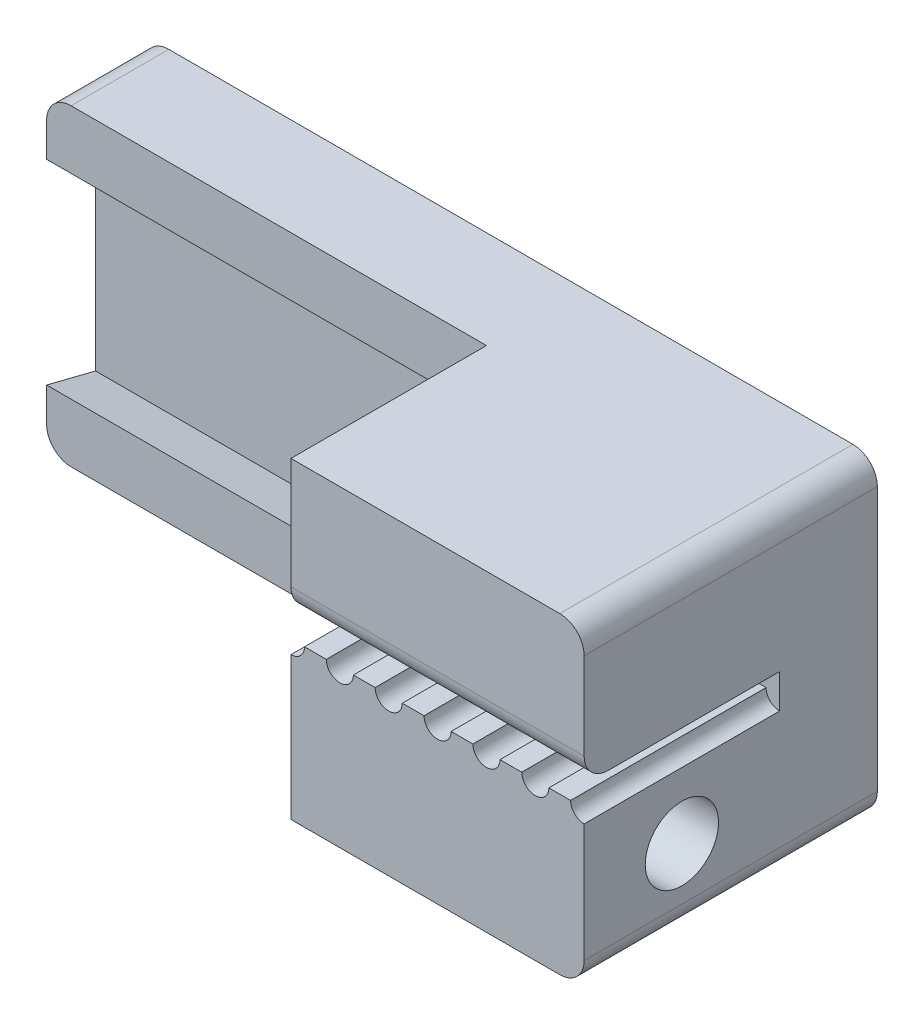
ISO-10303-21;
HEADER;
FILE_DESCRIPTION(('STEP AP214'),'2;1');
FILE_NAME('part.step','',(''),(''),'','','');
FILE_SCHEMA(('AUTOMOTIVE_DESIGN { 1 0 10303 214 1 1 1 1 }'));
ENDSEC;
DATA;
#1=APPLICATION_CONTEXT('core data for automotive mechanical design processes');
#2=APPLICATION_PROTOCOL_DEFINITION('international standard','automotive_design',2000,#1);
#3=PRODUCT_CONTEXT('',#1,'mechanical');
#4=PRODUCT('Part','Part','',(#3));
#5=PRODUCT_RELATED_PRODUCT_CATEGORY('part','',(#4));
#6=PRODUCT_DEFINITION_FORMATION('','',#4);
#7=PRODUCT_DEFINITION_CONTEXT('part definition',#1,'design');
#8=PRODUCT_DEFINITION('design','',#6,#7);
#9=PRODUCT_DEFINITION_SHAPE('','',#8);
#10=(LENGTH_UNIT() NAMED_UNIT(*) SI_UNIT(.MILLI.,.METRE.));
#11=(NAMED_UNIT(*) PLANE_ANGLE_UNIT() SI_UNIT($,.RADIAN.));
#12=(NAMED_UNIT(*) SI_UNIT($,.STERADIAN.) SOLID_ANGLE_UNIT());
#13=UNCERTAINTY_MEASURE_WITH_UNIT(LENGTH_MEASURE(1.E-05),#10,'distance_accuracy_value','');
#14=(GEOMETRIC_REPRESENTATION_CONTEXT(3) GLOBAL_UNCERTAINTY_ASSIGNED_CONTEXT((#13)) GLOBAL_UNIT_ASSIGNED_CONTEXT((#10,
#11,#12)) REPRESENTATION_CONTEXT('',''));
#15=CARTESIAN_POINT('',(0.,0.,0.));
#16=DIRECTION('',(0.,0.,1.));
#17=DIRECTION('',(1.,0.,0.));
#18=AXIS2_PLACEMENT_3D('',#15,#16,#17);
#19=CARTESIAN_POINT('',(-17.,1.1,12.));
#20=DIRECTION('',(0.,0.,-1.));
#21=DIRECTION('',(-1.,0.,0.));
#22=AXIS2_PLACEMENT_3D('',#19,#20,#21);
#23=PLANE('',#22);
#24=DIRECTION('',(0.,-1.,0.));
#25=VECTOR('',#24,1.);
#26=CARTESIAN_POINT('',(0.,12.9,12.));
#27=LINE('',#26,#25);
#28=CARTESIAN_POINT('',(0.,5.945,12.));
#29=VERTEX_POINT('',#28);
#30=CARTESIAN_POINT('',(0.,0.1,12.));
#31=VERTEX_POINT('',#30);
#32=EDGE_CURVE('E570',#29,#31,#27,.T.);
#33=ORIENTED_EDGE('',*,*,#32,.T.);
#34=DIRECTION('',(1.,0.,0.));
#35=VECTOR('',#34,1.);
#36=CARTESIAN_POINT('',(11.,0.1,12.));
#37=LINE('',#36,#35);
#38=CARTESIAN_POINT('',(11.,0.1,12.));
#39=VERTEX_POINT('',#38);
#40=EDGE_CURVE('E476',#31,#39,#37,.T.);
#41=ORIENTED_EDGE('',*,*,#40,.T.);
#42=CARTESIAN_POINT('',(11.,1.1,12.));
#43=DIRECTION('',(0.,0.,1.));
#44=DIRECTION('',(1.,0.,0.));
#45=AXIS2_PLACEMENT_3D('',#42,#43,#44);
#46=CIRCLE('',#45,0.999999999999999);
#47=CARTESIAN_POINT('',(12.,1.1,12.));
#48=VERTEX_POINT('',#47);
#49=EDGE_CURVE('E479',#39,#48,#46,.T.);
#50=ORIENTED_EDGE('',*,*,#49,.T.);
#51=DIRECTION('',(0.,1.,0.));
#52=VECTOR('',#51,1.);
#53=CARTESIAN_POINT('',(12.,1.10000000000001,12.));
#54=LINE('',#53,#52);
#55=CARTESIAN_POINT('',(12.,5.94500000000013,12.));
#56=VERTEX_POINT('',#55);
#57=EDGE_CURVE('E484',#48,#56,#54,.T.);
#58=ORIENTED_EDGE('',*,*,#57,.T.);
#59=CARTESIAN_POINT('',(12.,6.50000000000013,12.));
#60=DIRECTION('',(0.,0.,1.));
#61=DIRECTION('',(1.,0.,0.));
#62=AXIS2_PLACEMENT_3D('',#59,#60,#61);
#63=CIRCLE('',#62,0.555);
#64=CARTESIAN_POINT('',(11.445,6.50000000000012,12.));
#65=VERTEX_POINT('',#64);
#66=EDGE_CURVE('E383',#65,#56,#63,.T.);
#67=ORIENTED_EDGE('',*,*,#66,.F.);
#68=DIRECTION('',(1.,0.,0.));
#69=VECTOR('',#68,1.);
#70=CARTESIAN_POINT('',(11.445,6.50000000000012,12.));
#71=LINE('',#70,#69);
#72=CARTESIAN_POINT('',(10.555,6.50000000000012,12.));
#73=VERTEX_POINT('',#72);
#74=EDGE_CURVE('E379',#73,#65,#71,.T.);
#75=ORIENTED_EDGE('',*,*,#74,.F.);
#76=CARTESIAN_POINT('',(9.99999999999999,6.50000000000011,12.));
#77=DIRECTION('',(0.,0.,1.));
#78=DIRECTION('',(1.,0.,0.));
#79=AXIS2_PLACEMENT_3D('',#76,#77,#78);
#80=CIRCLE('',#79,0.555);
#81=CARTESIAN_POINT('',(9.44499999999999,6.5000000000001,12.));
#82=VERTEX_POINT('',#81);
#83=EDGE_CURVE('E310',#82,#73,#80,.T.);
#84=ORIENTED_EDGE('',*,*,#83,.F.);
#85=DIRECTION('',(1.,0.,0.));
#86=VECTOR('',#85,1.);
#87=CARTESIAN_POINT('',(9.44499999999999,6.5000000000001,12.));
#88=LINE('',#87,#86);
#89=CARTESIAN_POINT('',(8.555,6.50000000000009,12.));
#90=VERTEX_POINT('',#89);
#91=EDGE_CURVE('E316',#90,#82,#88,.T.);
#92=ORIENTED_EDGE('',*,*,#91,.F.);
#93=CARTESIAN_POINT('',(8.,6.50000000000009,12.));
#94=DIRECTION('',(0.,0.,1.));
#95=DIRECTION('',(1.,0.,0.));
#96=AXIS2_PLACEMENT_3D('',#93,#94,#95);
#97=CIRCLE('',#96,0.555);
#98=CARTESIAN_POINT('',(7.445,6.50000000000008,12.));
#99=VERTEX_POINT('',#98);
#100=EDGE_CURVE('E418',#99,#90,#97,.T.);
#101=ORIENTED_EDGE('',*,*,#100,.F.);
#102=DIRECTION('',(1.,0.,0.));
#103=VECTOR('',#102,1.);
#104=CARTESIAN_POINT('',(7.445,6.50000000000008,12.));
#105=LINE('',#104,#103);
#106=CARTESIAN_POINT('',(6.555,6.50000000000008,12.));
#107=VERTEX_POINT('',#106);
#108=EDGE_CURVE('E414',#107,#99,#105,.T.);
#109=ORIENTED_EDGE('',*,*,#108,.F.);
#110=CARTESIAN_POINT('',(6.,6.50000000000006,12.));
#111=DIRECTION('',(0.,0.,1.));
#112=DIRECTION('',(-1.,0.,0.));
#113=AXIS2_PLACEMENT_3D('',#110,#111,#112);
#114=CIRCLE('',#113,0.555);
#115=CARTESIAN_POINT('',(5.445,6.50000000000006,12.));
#116=VERTEX_POINT('',#115);
#117=EDGE_CURVE('E410',#116,#107,#114,.T.);
#118=ORIENTED_EDGE('',*,*,#117,.F.);
#119=DIRECTION('',(1.,0.,0.));
#120=VECTOR('',#119,1.);
#121=CARTESIAN_POINT('',(5.445,6.50000000000006,12.));
#122=LINE('',#121,#120);
#123=CARTESIAN_POINT('',(4.555,6.50000000000006,12.));
#124=VERTEX_POINT('',#123);
#125=EDGE_CURVE('E406',#124,#116,#122,.T.);
#126=ORIENTED_EDGE('',*,*,#125,.F.);
#127=CARTESIAN_POINT('',(4.,6.50000000000004,12.));
#128=DIRECTION('',(0.,0.,1.));
#129=DIRECTION('',(-1.,0.,0.));
#130=AXIS2_PLACEMENT_3D('',#127,#128,#129);
#131=CIRCLE('',#130,0.555000000000003);
#132=CARTESIAN_POINT('',(3.445,6.50000000000004,12.));
#133=VERTEX_POINT('',#132);
#134=EDGE_CURVE('E402',#133,#124,#131,.T.);
#135=ORIENTED_EDGE('',*,*,#134,.F.);
#136=DIRECTION('',(1.,0.,0.));
#137=VECTOR('',#136,1.);
#138=CARTESIAN_POINT('',(3.445,6.50000000000004,12.));
#139=LINE('',#138,#137);
#140=CARTESIAN_POINT('',(2.555,6.50000000000002,12.));
#141=VERTEX_POINT('',#140);
#142=EDGE_CURVE('E398',#141,#133,#139,.T.);
#143=ORIENTED_EDGE('',*,*,#142,.F.);
#144=CARTESIAN_POINT('',(2.,6.50000000000002,12.));
#145=DIRECTION('',(0.,0.,1.));
#146=DIRECTION('',(1.,0.,0.));
#147=AXIS2_PLACEMENT_3D('',#144,#145,#146);
#148=CIRCLE('',#147,0.555);
#149=CARTESIAN_POINT('',(1.445,6.50000000000002,12.));
#150=VERTEX_POINT('',#149);
#151=EDGE_CURVE('E394',#150,#141,#148,.T.);
#152=ORIENTED_EDGE('',*,*,#151,.F.);
#153=DIRECTION('',(1.,0.,0.));
#154=VECTOR('',#153,1.);
#155=CARTESIAN_POINT('',(1.445,6.50000000000002,12.));
#156=LINE('',#155,#154);
#157=CARTESIAN_POINT('',(0.555000000000007,6.50000000000002,12.));
#158=VERTEX_POINT('',#157);
#159=EDGE_CURVE('E390',#158,#150,#156,.T.);
#160=ORIENTED_EDGE('',*,*,#159,.F.);
#161=CARTESIAN_POINT('',(0.,6.5,12.));
#162=DIRECTION('',(0.,0.,1.));
#163=DIRECTION('',(-1.,0.,0.));
#164=AXIS2_PLACEMENT_3D('',#161,#162,#163);
#165=CIRCLE('',#164,0.555000000000007);
#166=EDGE_CURVE('E386',#29,#158,#165,.T.);
#167=ORIENTED_EDGE('',*,*,#166,.F.);
#168=EDGE_LOOP('',(#33,#41,#50,#58,#67,#75,#84,#92,#101,#109,#118,#126,#135,#143,#152,#160,#167));
#169=FACE_BOUND('',#168,.T.);
#170=ADVANCED_FACE('F39',(#169),#23,.F.);
#171=CARTESIAN_POINT('',(0.,12.9,12.));
#172=VERTEX_POINT('',#171);
#173=CARTESIAN_POINT('',(0.,8.34499999999995,12.));
#174=VERTEX_POINT('',#173);
#175=EDGE_CURVE('E567',#172,#174,#27,.T.);
#176=ORIENTED_EDGE('',*,*,#175,.T.);
#177=DIRECTION('',(-1.,0.,0.));
#178=VECTOR('',#177,1.);
#179=CARTESIAN_POINT('',(-17.,8.34499999999995,12.));
#180=LINE('',#179,#178);
#181=CARTESIAN_POINT('',(12.,8.34499999999995,12.));
#182=VERTEX_POINT('',#181);
#183=EDGE_CURVE('E55',#174,#182,#180,.F.);
#184=ORIENTED_EDGE('',*,*,#183,.T.);
#185=CARTESIAN_POINT('',(12.,11.9,12.));
#186=VERTEX_POINT('',#185);
#187=EDGE_CURVE('E483',#182,#186,#54,.T.);
#188=ORIENTED_EDGE('',*,*,#187,.T.);
#189=CARTESIAN_POINT('',(11.,11.9,12.));
#190=DIRECTION('',(0.,0.,1.));
#191=DIRECTION('',(-1.,0.,0.));
#192=AXIS2_PLACEMENT_3D('',#189,#190,#191);
#193=CIRCLE('',#192,1.);
#194=CARTESIAN_POINT('',(11.,12.9,12.));
#195=VERTEX_POINT('',#194);
#196=EDGE_CURVE('E488',#186,#195,#193,.T.);
#197=ORIENTED_EDGE('',*,*,#196,.T.);
#198=DIRECTION('',(-1.,0.,0.));
#199=VECTOR('',#198,1.);
#200=CARTESIAN_POINT('',(11.,12.9,12.));
#201=LINE('',#200,#199);
#202=EDGE_CURVE('E491',#195,#172,#201,.T.);
#203=ORIENTED_EDGE('',*,*,#202,.T.);
#204=EDGE_LOOP('',(#176,#184,#188,#197,#203));
#205=FACE_BOUND('',#204,.T.);
#206=ADVANCED_FACE('F628',(#205),#23,.F.);
#207=CARTESIAN_POINT('',(-17.,1.1,12.));
#208=DIRECTION('',(0.,0.,-1.));
#209=DIRECTION('',(-1.,0.,0.));
#210=AXIS2_PLACEMENT_3D('',#207,#208,#209);
#211=CYLINDRICAL_SURFACE('',#210,1.);
#212=DIRECTION('',(0.,0.,-1.));
#213=VECTOR('',#212,1.);
#214=CARTESIAN_POINT('',(-17.,0.1,12.));
#215=LINE('',#214,#213);
#216=CARTESIAN_POINT('',(-17.,0.1,3.99999999999981));
#217=VERTEX_POINT('',#216);
#218=CARTESIAN_POINT('',(-17.,0.1,0.));
#219=VERTEX_POINT('',#218);
#220=EDGE_CURVE('E546',#217,#219,#215,.T.);
#221=ORIENTED_EDGE('',*,*,#220,.F.);
#222=CARTESIAN_POINT('',(-17.,1.1,3.99999999999981));
#223=DIRECTION('',(0.,0.,-1.));
#224=DIRECTION('',(-1.,0.,0.));
#225=AXIS2_PLACEMENT_3D('',#222,#223,#224);
#226=CIRCLE('',#225,1.);
#227=CARTESIAN_POINT('',(-18.,1.10000000000001,3.99999999999981));
#228=VERTEX_POINT('',#227);
#229=EDGE_CURVE('E301',#217,#228,#226,.T.);
#230=ORIENTED_EDGE('',*,*,#229,.T.);
#231=DIRECTION('',(0.,0.,-1.));
#232=VECTOR('',#231,1.);
#233=CARTESIAN_POINT('',(-18.,1.10000000000001,12.));
#234=LINE('',#233,#232);
#235=CARTESIAN_POINT('',(-18.,1.10000000000001,0.));
#236=VERTEX_POINT('',#235);
#237=EDGE_CURVE('E495',#228,#236,#234,.T.);
#238=ORIENTED_EDGE('',*,*,#237,.T.);
#239=CARTESIAN_POINT('',(-17.,1.1,0.));
#240=DIRECTION('',(0.,0.,1.));
#241=DIRECTION('',(-1.,0.,0.));
#242=AXIS2_PLACEMENT_3D('',#239,#240,#241);
#243=CIRCLE('',#242,1.);
#244=EDGE_CURVE('E428',#236,#219,#243,.T.);
#245=ORIENTED_EDGE('',*,*,#244,.T.);
#246=EDGE_LOOP('',(#221,#230,#238,#245));
#247=FACE_BOUND('',#246,.T.);
#248=ADVANCED_FACE('F634',(#247),#211,.T.);
#249=CARTESIAN_POINT('',(11.,0.1,12.));
#250=DIRECTION('',(0.,1.,0.));
#251=DIRECTION('',(0.,0.,1.));
#252=AXIS2_PLACEMENT_3D('',#249,#250,#251);
#253=PLANE('',#252);
#254=DIRECTION('',(0.,0.,-1.));
#255=VECTOR('',#254,1.);
#256=CARTESIAN_POINT('',(0.,0.1,12.));
#257=LINE('',#256,#255);
#258=CARTESIAN_POINT('',(0.,0.1,3.99999999999981));
#259=VERTEX_POINT('',#258);
#260=EDGE_CURVE('E574',#31,#259,#257,.T.);
#261=ORIENTED_EDGE('',*,*,#260,.T.);
#262=DIRECTION('',(-1.,0.,0.));
#263=VECTOR('',#262,1.);
#264=CARTESIAN_POINT('',(16.2431524033976,0.1,3.99999999999981));
#265=LINE('',#264,#263);
#266=EDGE_CURVE('E293',#259,#217,#265,.T.);
#267=ORIENTED_EDGE('',*,*,#266,.T.);
#268=ORIENTED_EDGE('',*,*,#220,.T.);
#269=DIRECTION('',(1.,0.,0.));
#270=VECTOR('',#269,1.);
#271=CARTESIAN_POINT('',(11.,0.1,0.));
#272=LINE('',#271,#270);
#273=CARTESIAN_POINT('',(11.,0.1,0.));
#274=VERTEX_POINT('',#273);
#275=EDGE_CURVE('E499',#219,#274,#272,.T.);
#276=ORIENTED_EDGE('',*,*,#275,.T.);
#277=DIRECTION('',(0.,0.,-1.));
#278=VECTOR('',#277,1.);
#279=CARTESIAN_POINT('',(11.,0.1,12.));
#280=LINE('',#279,#278);
#281=EDGE_CURVE('E542',#39,#274,#280,.T.);
#282=ORIENTED_EDGE('',*,*,#281,.F.);
#283=ORIENTED_EDGE('',*,*,#40,.F.);
#284=EDGE_LOOP('',(#261,#267,#268,#276,#282,#283));
#285=FACE_BOUND('',#284,.T.);
#286=ADVANCED_FACE('F662',(#285),#253,.F.);
#287=CARTESIAN_POINT('',(11.,1.1,12.));
#288=DIRECTION('',(0.,0.,-1.));
#289=DIRECTION('',(-1.,0.,0.));
#290=AXIS2_PLACEMENT_3D('',#287,#288,#289);
#291=CYLINDRICAL_SURFACE('',#290,0.999999999999999);
#292=CARTESIAN_POINT('',(11.,1.1,0.));
#293=DIRECTION('',(0.,0.,1.));
#294=DIRECTION('',(1.,0.,0.));
#295=AXIS2_PLACEMENT_3D('',#292,#293,#294);
#296=CIRCLE('',#295,0.999999999999999);
#297=CARTESIAN_POINT('',(12.,1.1,0.));
#298=VERTEX_POINT('',#297);
#299=EDGE_CURVE('E502',#274,#298,#296,.T.);
#300=ORIENTED_EDGE('',*,*,#299,.T.);
#301=DIRECTION('',(0.,0.,-1.));
#302=VECTOR('',#301,1.);
#303=CARTESIAN_POINT('',(12.,1.1,12.));
#304=LINE('',#303,#302);
#305=EDGE_CURVE('E538',#48,#298,#304,.T.);
#306=ORIENTED_EDGE('',*,*,#305,.F.);
#307=ORIENTED_EDGE('',*,*,#49,.F.);
#308=ORIENTED_EDGE('',*,*,#281,.T.);
#309=EDGE_LOOP('',(#300,#306,#307,#308));
#310=FACE_BOUND('',#309,.T.);
#311=ADVANCED_FACE('F659',(#310),#291,.T.);
#312=CARTESIAN_POINT('',(12.,1.10000000000001,12.));
#313=DIRECTION('',(-1.,0.,0.));
#314=DIRECTION('',(0.,0.,1.));
#315=AXIS2_PLACEMENT_3D('',#312,#313,#314);
#316=PLANE('',#315);
#317=CARTESIAN_POINT('',(12.,3.25000000000001,8.));
#318=DIRECTION('',(-1.,0.,0.));
#319=DIRECTION('',(0.,0.,1.));
#320=AXIS2_PLACEMENT_3D('',#317,#318,#319);
#321=CIRCLE('',#320,1.5);
#322=CARTESIAN_POINT('',(12.,3.25000000000001,9.5));
#323=VERTEX_POINT('',#322);
#324=EDGE_CURVE('E585',#323,#323,#321,.T.);
#325=ORIENTED_EDGE('',*,*,#324,.T.);
#326=EDGE_LOOP('',(#325));
#327=FACE_BOUND('',#326,.T.);
#328=ORIENTED_EDGE('',*,*,#187,.F.);
#329=CARTESIAN_POINT('',(12.,8.34499999999995,11.));
#330=DIRECTION('',(-1.,0.,0.));
#331=DIRECTION('',(0.,0.,1.));
#332=AXIS2_PLACEMENT_3D('',#329,#330,#331);
#333=CIRCLE('',#332,1.);
#334=CARTESIAN_POINT('',(12.,7.34499999999995,11.));
#335=VERTEX_POINT('',#334);
#336=EDGE_CURVE('E48',#182,#335,#333,.F.);
#337=ORIENTED_EDGE('',*,*,#336,.T.);
#338=DIRECTION('',(0.,0.,1.));
#339=VECTOR('',#338,1.);
#340=CARTESIAN_POINT('',(12.,7.34499999999995,4.));
#341=LINE('',#340,#339);
#342=CARTESIAN_POINT('',(12.,7.34499999999995,4.));
#343=VERTEX_POINT('',#342);
#344=EDGE_CURVE('E463',#343,#335,#341,.T.);
#345=ORIENTED_EDGE('',*,*,#344,.F.);
#346=DIRECTION('',(0.,1.,0.));
#347=VECTOR('',#346,1.);
#348=CARTESIAN_POINT('',(12.,7.34499999999995,4.));
#349=LINE('',#348,#347);
#350=CARTESIAN_POINT('',(12.,5.94500000000013,4.));
#351=VERTEX_POINT('',#350);
#352=EDGE_CURVE('E324',#351,#343,#349,.T.);
#353=ORIENTED_EDGE('',*,*,#352,.F.);
#354=DIRECTION('',(0.,0.,1.));
#355=VECTOR('',#354,1.);
#356=CARTESIAN_POINT('',(12.,5.94500000000013,4.));
#357=LINE('',#356,#355);
#358=EDGE_CURVE('E466',#351,#56,#357,.T.);
#359=ORIENTED_EDGE('',*,*,#358,.T.);
#360=ORIENTED_EDGE('',*,*,#57,.F.);
#361=ORIENTED_EDGE('',*,*,#305,.T.);
#362=DIRECTION('',(0.,1.,0.));
#363=VECTOR('',#362,1.);
#364=CARTESIAN_POINT('',(12.,1.10000000000001,0.));
#365=LINE('',#364,#363);
#366=CARTESIAN_POINT('',(12.,11.9,0.));
#367=VERTEX_POINT('',#366);
#368=EDGE_CURVE('E505',#298,#367,#365,.T.);
#369=ORIENTED_EDGE('',*,*,#368,.T.);
#370=DIRECTION('',(0.,0.,-1.));
#371=VECTOR('',#370,1.);
#372=CARTESIAN_POINT('',(12.,11.9,12.));
#373=LINE('',#372,#371);
#374=EDGE_CURVE('E534',#186,#367,#373,.T.);
#375=ORIENTED_EDGE('',*,*,#374,.F.);
#376=EDGE_LOOP('',(#328,#337,#345,#353,#359,#360,#361,#369,#375));
#377=FACE_BOUND('',#376,.T.);
#378=ADVANCED_FACE('F590',(#327,#377),#316,.F.);
#379=CARTESIAN_POINT('',(11.,11.9,12.));
#380=DIRECTION('',(0.,0.,-1.));
#381=DIRECTION('',(-1.,0.,0.));
#382=AXIS2_PLACEMENT_3D('',#379,#380,#381);
#383=CYLINDRICAL_SURFACE('',#382,1.);
#384=CARTESIAN_POINT('',(11.,11.9,0.));
#385=DIRECTION('',(0.,0.,1.));
#386=DIRECTION('',(-1.,0.,0.));
#387=AXIS2_PLACEMENT_3D('',#384,#385,#386);
#388=CIRCLE('',#387,1.);
#389=CARTESIAN_POINT('',(11.,12.9,0.));
#390=VERTEX_POINT('',#389);
#391=EDGE_CURVE('E508',#367,#390,#388,.T.);
#392=ORIENTED_EDGE('',*,*,#391,.T.);
#393=DIRECTION('',(0.,0.,-1.));
#394=VECTOR('',#393,1.);
#395=CARTESIAN_POINT('',(11.,12.9,12.));
#396=LINE('',#395,#394);
#397=EDGE_CURVE('E530',#195,#390,#396,.T.);
#398=ORIENTED_EDGE('',*,*,#397,.F.);
#399=ORIENTED_EDGE('',*,*,#196,.F.);
#400=ORIENTED_EDGE('',*,*,#374,.T.);
#401=EDGE_LOOP('',(#392,#398,#399,#400));
#402=FACE_BOUND('',#401,.T.);
#403=ADVANCED_FACE('F652',(#402),#383,.T.);
#404=CARTESIAN_POINT('',(11.,12.9,12.));
#405=DIRECTION('',(0.,-1.,0.));
#406=DIRECTION('',(0.,0.,-1.));
#407=AXIS2_PLACEMENT_3D('',#404,#405,#406);
#408=PLANE('',#407);
#409=DIRECTION('',(0.,0.,-1.));
#410=VECTOR('',#409,1.);
#411=CARTESIAN_POINT('',(-17.,12.9,12.));
#412=LINE('',#411,#410);
#413=CARTESIAN_POINT('',(-17.,12.9,3.99999999999981));
#414=VERTEX_POINT('',#413);
#415=CARTESIAN_POINT('',(-17.,12.9,0.));
#416=VERTEX_POINT('',#415);
#417=EDGE_CURVE('E527',#414,#416,#412,.T.);
#418=ORIENTED_EDGE('',*,*,#417,.F.);
#419=DIRECTION('',(-1.,0.,0.));
#420=VECTOR('',#419,1.);
#421=CARTESIAN_POINT('',(16.2431524033976,12.9,3.99999999999981));
#422=LINE('',#421,#420);
#423=CARTESIAN_POINT('',(0.,12.9,3.99999999999981));
#424=VERTEX_POINT('',#423);
#425=EDGE_CURVE('E290',#424,#414,#422,.T.);
#426=ORIENTED_EDGE('',*,*,#425,.F.);
#427=DIRECTION('',(0.,0.,1.));
#428=VECTOR('',#427,1.);
#429=CARTESIAN_POINT('',(0.,12.9,3.99999999999981));
#430=LINE('',#429,#428);
#431=EDGE_CURVE('E563',#424,#172,#430,.T.);
#432=ORIENTED_EDGE('',*,*,#431,.T.);
#433=ORIENTED_EDGE('',*,*,#202,.F.);
#434=ORIENTED_EDGE('',*,*,#397,.T.);
#435=DIRECTION('',(-1.,0.,0.));
#436=VECTOR('',#435,1.);
#437=CARTESIAN_POINT('',(11.,12.9,0.));
#438=LINE('',#437,#436);
#439=EDGE_CURVE('E511',#390,#416,#438,.T.);
#440=ORIENTED_EDGE('',*,*,#439,.T.);
#441=EDGE_LOOP('',(#418,#426,#432,#433,#434,#440));
#442=FACE_BOUND('',#441,.T.);
#443=ADVANCED_FACE('F648',(#442),#408,.F.);
#444=CARTESIAN_POINT('',(-17.,11.9,12.));
#445=DIRECTION('',(0.,0.,-1.));
#446=DIRECTION('',(-1.,0.,0.));
#447=AXIS2_PLACEMENT_3D('',#444,#445,#446);
#448=CYLINDRICAL_SURFACE('',#447,1.);
#449=DIRECTION('',(0.,0.,-1.));
#450=VECTOR('',#449,1.);
#451=CARTESIAN_POINT('',(-18.,11.9,12.));
#452=LINE('',#451,#450);
#453=CARTESIAN_POINT('',(-18.,11.9,3.99999999999981));
#454=VERTEX_POINT('',#453);
#455=CARTESIAN_POINT('',(-18.,11.9,0.));
#456=VERTEX_POINT('',#455);
#457=EDGE_CURVE('E524',#454,#456,#452,.T.);
#458=ORIENTED_EDGE('',*,*,#457,.F.);
#459=CARTESIAN_POINT('',(-17.,11.9,3.99999999999981));
#460=DIRECTION('',(0.,0.,-1.));
#461=DIRECTION('',(-1.,0.,0.));
#462=AXIS2_PLACEMENT_3D('',#459,#460,#461);
#463=CIRCLE('',#462,1.);
#464=EDGE_CURVE('E306',#454,#414,#463,.T.);
#465=ORIENTED_EDGE('',*,*,#464,.T.);
#466=ORIENTED_EDGE('',*,*,#417,.T.);
#467=CARTESIAN_POINT('',(-17.,11.9,0.));
#468=DIRECTION('',(0.,0.,1.));
#469=DIRECTION('',(1.,0.,0.));
#470=AXIS2_PLACEMENT_3D('',#467,#468,#469);
#471=CIRCLE('',#470,1.);
#472=EDGE_CURVE('E515',#416,#456,#471,.T.);
#473=ORIENTED_EDGE('',*,*,#472,.T.);
#474=EDGE_LOOP('',(#458,#465,#466,#473));
#475=FACE_BOUND('',#474,.T.);
#476=ADVANCED_FACE('F645',(#475),#448,.T.);
#477=CARTESIAN_POINT('',(-18.,11.9,12.));
#478=DIRECTION('',(1.,0.,0.));
#479=DIRECTION('',(0.,0.,-1.));
#480=AXIS2_PLACEMENT_3D('',#477,#478,#479);
#481=PLANE('',#480);
#482=DIRECTION('',(0.,0.242535625036323,-0.970142500145334));
#483=VECTOR('',#482,1.);
#484=CARTESIAN_POINT('',(-18.,11.,1.9999999999999));
#485=LINE('',#484,#483);
#486=CARTESIAN_POINT('',(-18.,10.5,3.99999999999981));
#487=VERTEX_POINT('',#486);
#488=CARTESIAN_POINT('',(-18.,11.,1.9999999999999));
#489=VERTEX_POINT('',#488);
#490=EDGE_CURVE('E256',#487,#489,#485,.T.);
#491=ORIENTED_EDGE('',*,*,#490,.F.);
#492=DIRECTION('',(0.,-1.,0.));
#493=VECTOR('',#492,1.);
#494=CARTESIAN_POINT('',(-18.,10.5,3.99999999999981));
#495=LINE('',#494,#493);
#496=EDGE_CURVE('E275',#454,#487,#495,.T.);
#497=ORIENTED_EDGE('',*,*,#496,.F.);
#498=ORIENTED_EDGE('',*,*,#457,.T.);
#499=DIRECTION('',(0.,-1.,0.));
#500=VECTOR('',#499,1.);
#501=CARTESIAN_POINT('',(-18.,11.9,0.));
#502=LINE('',#501,#500);
#503=EDGE_CURVE('E480',#456,#236,#502,.T.);
#504=ORIENTED_EDGE('',*,*,#503,.T.);
#505=ORIENTED_EDGE('',*,*,#237,.F.);
#506=DIRECTION('',(0.,-1.,0.));
#507=VECTOR('',#506,1.);
#508=CARTESIAN_POINT('',(-18.,0.1,3.99999999999981));
#509=LINE('',#508,#507);
#510=CARTESIAN_POINT('',(-18.,2.50000000000001,3.99999999999981));
#511=VERTEX_POINT('',#510);
#512=EDGE_CURVE('E271',#511,#228,#509,.T.);
#513=ORIENTED_EDGE('',*,*,#512,.F.);
#514=DIRECTION('',(0.,0.242535625036344,0.970142500145329));
#515=VECTOR('',#514,1.);
#516=CARTESIAN_POINT('',(-18.,2.50000000000001,3.99999999999981));
#517=LINE('',#516,#515);
#518=CARTESIAN_POINT('',(-18.,2.00000000000001,1.9999999999999));
#519=VERTEX_POINT('',#518);
#520=EDGE_CURVE('E248',#519,#511,#517,.T.);
#521=ORIENTED_EDGE('',*,*,#520,.F.);
#522=DIRECTION('',(0.,-1.,0.));
#523=VECTOR('',#522,1.);
#524=CARTESIAN_POINT('',(-18.,2.00000000000001,1.9999999999999));
#525=LINE('',#524,#523);
#526=EDGE_CURVE('E259',#489,#519,#525,.T.);
#527=ORIENTED_EDGE('',*,*,#526,.F.);
#528=EDGE_LOOP('',(#491,#497,#498,#504,#505,#513,#521,#527));
#529=FACE_BOUND('',#528,.T.);
#530=ADVANCED_FACE('F269',(#529),#481,.F.);
#531=CARTESIAN_POINT('',(-17.,1.1,0.));
#532=DIRECTION('',(0.,0.,-1.));
#533=DIRECTION('',(-1.,0.,0.));
#534=AXIS2_PLACEMENT_3D('',#531,#532,#533);
#535=PLANE('',#534);
#536=ORIENTED_EDGE('',*,*,#244,.F.);
#537=ORIENTED_EDGE('',*,*,#503,.F.);
#538=ORIENTED_EDGE('',*,*,#472,.F.);
#539=ORIENTED_EDGE('',*,*,#439,.F.);
#540=ORIENTED_EDGE('',*,*,#391,.F.);
#541=ORIENTED_EDGE('',*,*,#368,.F.);
#542=ORIENTED_EDGE('',*,*,#299,.F.);
#543=ORIENTED_EDGE('',*,*,#275,.F.);
#544=EDGE_LOOP('',(#536,#537,#538,#539,#540,#541,#542,#543));
#545=FACE_BOUND('',#544,.T.);
#546=ADVANCED_FACE('F639',(#545),#535,.T.);
#547=CARTESIAN_POINT('',(9.99999999999999,6.50000000000011,4.));
#548=DIRECTION('',(0.,0.,1.));
#549=DIRECTION('',(1.,0.,0.));
#550=AXIS2_PLACEMENT_3D('',#547,#548,#549);
#551=CYLINDRICAL_SURFACE('',#550,0.555);
#552=ORIENTED_EDGE('',*,*,#83,.T.);
#553=DIRECTION('',(0.,0.,1.));
#554=VECTOR('',#553,1.);
#555=CARTESIAN_POINT('',(10.555,6.50000000000012,4.));
#556=LINE('',#555,#554);
#557=CARTESIAN_POINT('',(10.555,6.50000000000012,4.));
#558=VERTEX_POINT('',#557);
#559=EDGE_CURVE('E376',#558,#73,#556,.T.);
#560=ORIENTED_EDGE('',*,*,#559,.F.);
#561=CARTESIAN_POINT('',(9.99999999999999,6.50000000000011,4.));
#562=DIRECTION('',(0.,0.,1.));
#563=DIRECTION('',(1.,0.,0.));
#564=AXIS2_PLACEMENT_3D('',#561,#562,#563);
#565=CIRCLE('',#564,0.555);
#566=CARTESIAN_POINT('',(9.44499999999999,6.5000000000001,4.));
#567=VERTEX_POINT('',#566);
#568=EDGE_CURVE('E311',#567,#558,#565,.T.);
#569=ORIENTED_EDGE('',*,*,#568,.F.);
#570=DIRECTION('',(0.,0.,1.));
#571=VECTOR('',#570,1.);
#572=CARTESIAN_POINT('',(9.44499999999999,6.5000000000001,4.));
#573=LINE('',#572,#571);
#574=EDGE_CURVE('E425',#567,#82,#573,.T.);
#575=ORIENTED_EDGE('',*,*,#574,.T.);
#576=EDGE_LOOP('',(#552,#560,#569,#575));
#577=FACE_BOUND('',#576,.T.);
#578=ADVANCED_FACE('F637',(#577),#551,.F.);
#579=CARTESIAN_POINT('',(9.44499999999999,6.5000000000001,4.));
#580=DIRECTION('',(0.,-1.,0.));
#581=DIRECTION('',(0.,0.,-1.));
#582=AXIS2_PLACEMENT_3D('',#579,#580,#581);
#583=PLANE('',#582);
#584=ORIENTED_EDGE('',*,*,#91,.T.);
#585=ORIENTED_EDGE('',*,*,#574,.F.);
#586=DIRECTION('',(1.,0.,0.));
#587=VECTOR('',#586,1.);
#588=CARTESIAN_POINT('',(9.44499999999999,6.5000000000001,4.));
#589=LINE('',#588,#587);
#590=CARTESIAN_POINT('',(8.555,6.50000000000009,4.));
#591=VERTEX_POINT('',#590);
#592=EDGE_CURVE('E372',#591,#567,#589,.T.);
#593=ORIENTED_EDGE('',*,*,#592,.F.);
#594=DIRECTION('',(0.,0.,1.));
#595=VECTOR('',#594,1.);
#596=CARTESIAN_POINT('',(8.555,6.50000000000009,4.));
#597=LINE('',#596,#595);
#598=EDGE_CURVE('E429',#591,#90,#597,.T.);
#599=ORIENTED_EDGE('',*,*,#598,.T.);
#600=EDGE_LOOP('',(#584,#585,#593,#599));
#601=FACE_BOUND('',#600,.T.);
#602=ADVANCED_FACE('F696',(#601),#583,.F.);
#603=CARTESIAN_POINT('',(8.,6.50000000000009,4.));
#604=DIRECTION('',(0.,0.,1.));
#605=DIRECTION('',(1.,0.,0.));
#606=AXIS2_PLACEMENT_3D('',#603,#604,#605);
#607=CYLINDRICAL_SURFACE('',#606,0.555);
#608=ORIENTED_EDGE('',*,*,#100,.T.);
#609=ORIENTED_EDGE('',*,*,#598,.F.);
#610=CARTESIAN_POINT('',(8.,6.50000000000009,4.));
#611=DIRECTION('',(0.,0.,1.));
#612=DIRECTION('',(1.,0.,0.));
#613=AXIS2_PLACEMENT_3D('',#610,#611,#612);
#614=CIRCLE('',#613,0.555);
#615=CARTESIAN_POINT('',(7.445,6.50000000000008,4.));
#616=VERTEX_POINT('',#615);
#617=EDGE_CURVE('E368',#616,#591,#614,.T.);
#618=ORIENTED_EDGE('',*,*,#617,.F.);
#619=DIRECTION('',(0.,0.,1.));
#620=VECTOR('',#619,1.);
#621=CARTESIAN_POINT('',(7.445,6.50000000000008,4.));
#622=LINE('',#621,#620);
#623=EDGE_CURVE('E432',#616,#99,#622,.T.);
#624=ORIENTED_EDGE('',*,*,#623,.T.);
#625=EDGE_LOOP('',(#608,#609,#618,#624));
#626=FACE_BOUND('',#625,.T.);
#627=ADVANCED_FACE('F699',(#626),#607,.F.);
#628=CARTESIAN_POINT('',(7.445,6.50000000000008,4.));
#629=DIRECTION('',(0.,-1.,0.));
#630=DIRECTION('',(0.,0.,-1.));
#631=AXIS2_PLACEMENT_3D('',#628,#629,#630);
#632=PLANE('',#631);
#633=ORIENTED_EDGE('',*,*,#108,.T.);
#634=ORIENTED_EDGE('',*,*,#623,.F.);
#635=DIRECTION('',(1.,0.,0.));
#636=VECTOR('',#635,1.);
#637=CARTESIAN_POINT('',(7.445,6.50000000000008,4.));
#638=LINE('',#637,#636);
#639=CARTESIAN_POINT('',(6.555,6.50000000000008,4.));
#640=VERTEX_POINT('',#639);
#641=EDGE_CURVE('E364',#640,#616,#638,.T.);
#642=ORIENTED_EDGE('',*,*,#641,.F.);
#643=DIRECTION('',(0.,0.,1.));
#644=VECTOR('',#643,1.);
#645=CARTESIAN_POINT('',(6.555,6.50000000000008,4.));
#646=LINE('',#645,#644);
#647=EDGE_CURVE('E435',#640,#107,#646,.T.);
#648=ORIENTED_EDGE('',*,*,#647,.T.);
#649=EDGE_LOOP('',(#633,#634,#642,#648));
#650=FACE_BOUND('',#649,.T.);
#651=ADVANCED_FACE('F703',(#650),#632,.F.);
#652=CARTESIAN_POINT('',(6.,6.50000000000006,4.));
#653=DIRECTION('',(0.,0.,1.));
#654=DIRECTION('',(1.,0.,0.));
#655=AXIS2_PLACEMENT_3D('',#652,#653,#654);
#656=CYLINDRICAL_SURFACE('',#655,0.555);
#657=ORIENTED_EDGE('',*,*,#117,.T.);
#658=ORIENTED_EDGE('',*,*,#647,.F.);
#659=CARTESIAN_POINT('',(6.,6.50000000000006,4.));
#660=DIRECTION('',(0.,0.,1.));
#661=DIRECTION('',(-1.,0.,0.));
#662=AXIS2_PLACEMENT_3D('',#659,#660,#661);
#663=CIRCLE('',#662,0.555);
#664=CARTESIAN_POINT('',(5.445,6.50000000000006,4.));
#665=VERTEX_POINT('',#664);
#666=EDGE_CURVE('E360',#665,#640,#663,.T.);
#667=ORIENTED_EDGE('',*,*,#666,.F.);
#668=DIRECTION('',(0.,0.,1.));
#669=VECTOR('',#668,1.);
#670=CARTESIAN_POINT('',(5.445,6.50000000000006,4.));
#671=LINE('',#670,#669);
#672=EDGE_CURVE('E438',#665,#116,#671,.T.);
#673=ORIENTED_EDGE('',*,*,#672,.T.);
#674=EDGE_LOOP('',(#657,#658,#667,#673));
#675=FACE_BOUND('',#674,.T.);
#676=ADVANCED_FACE('F707',(#675),#656,.F.);
#677=CARTESIAN_POINT('',(5.445,6.50000000000006,4.));
#678=DIRECTION('',(0.,-1.,0.));
#679=DIRECTION('',(0.,0.,-1.));
#680=AXIS2_PLACEMENT_3D('',#677,#678,#679);
#681=PLANE('',#680);
#682=ORIENTED_EDGE('',*,*,#125,.T.);
#683=ORIENTED_EDGE('',*,*,#672,.F.);
#684=DIRECTION('',(1.,0.,0.));
#685=VECTOR('',#684,1.);
#686=CARTESIAN_POINT('',(5.445,6.50000000000006,4.));
#687=LINE('',#686,#685);
#688=CARTESIAN_POINT('',(4.555,6.50000000000006,4.));
#689=VERTEX_POINT('',#688);
#690=EDGE_CURVE('E356',#689,#665,#687,.T.);
#691=ORIENTED_EDGE('',*,*,#690,.F.);
#692=DIRECTION('',(0.,0.,1.));
#693=VECTOR('',#692,1.);
#694=CARTESIAN_POINT('',(4.555,6.50000000000006,4.));
#695=LINE('',#694,#693);
#696=EDGE_CURVE('E441',#689,#124,#695,.T.);
#697=ORIENTED_EDGE('',*,*,#696,.T.);
#698=EDGE_LOOP('',(#682,#683,#691,#697));
#699=FACE_BOUND('',#698,.T.);
#700=ADVANCED_FACE('F711',(#699),#681,.F.);
#701=CARTESIAN_POINT('',(4.,6.50000000000004,4.));
#702=DIRECTION('',(0.,0.,1.));
#703=DIRECTION('',(1.,0.,0.));
#704=AXIS2_PLACEMENT_3D('',#701,#702,#703);
#705=CYLINDRICAL_SURFACE('',#704,0.555000000000003);
#706=ORIENTED_EDGE('',*,*,#134,.T.);
#707=ORIENTED_EDGE('',*,*,#696,.F.);
#708=CARTESIAN_POINT('',(4.,6.50000000000004,4.));
#709=DIRECTION('',(0.,0.,1.));
#710=DIRECTION('',(-1.,0.,0.));
#711=AXIS2_PLACEMENT_3D('',#708,#709,#710);
#712=CIRCLE('',#711,0.555000000000003);
#713=CARTESIAN_POINT('',(3.445,6.50000000000004,4.));
#714=VERTEX_POINT('',#713);
#715=EDGE_CURVE('E352',#714,#689,#712,.T.);
#716=ORIENTED_EDGE('',*,*,#715,.F.);
#717=DIRECTION('',(0.,0.,1.));
#718=VECTOR('',#717,1.);
#719=CARTESIAN_POINT('',(3.445,6.50000000000004,4.));
#720=LINE('',#719,#718);
#721=EDGE_CURVE('E444',#714,#133,#720,.T.);
#722=ORIENTED_EDGE('',*,*,#721,.T.);
#723=EDGE_LOOP('',(#706,#707,#716,#722));
#724=FACE_BOUND('',#723,.T.);
#725=ADVANCED_FACE('F715',(#724),#705,.F.);
#726=CARTESIAN_POINT('',(3.445,6.50000000000004,4.));
#727=DIRECTION('',(0.,-1.,0.));
#728=DIRECTION('',(0.,0.,-1.));
#729=AXIS2_PLACEMENT_3D('',#726,#727,#728);
#730=PLANE('',#729);
#731=ORIENTED_EDGE('',*,*,#142,.T.);
#732=ORIENTED_EDGE('',*,*,#721,.F.);
#733=DIRECTION('',(1.,0.,0.));
#734=VECTOR('',#733,1.);
#735=CARTESIAN_POINT('',(3.445,6.50000000000004,4.));
#736=LINE('',#735,#734);
#737=CARTESIAN_POINT('',(2.555,6.50000000000002,4.));
#738=VERTEX_POINT('',#737);
#739=EDGE_CURVE('E348',#738,#714,#736,.T.);
#740=ORIENTED_EDGE('',*,*,#739,.F.);
#741=DIRECTION('',(0.,0.,1.));
#742=VECTOR('',#741,1.);
#743=CARTESIAN_POINT('',(2.555,6.50000000000002,4.));
#744=LINE('',#743,#742);
#745=EDGE_CURVE('E447',#738,#141,#744,.T.);
#746=ORIENTED_EDGE('',*,*,#745,.T.);
#747=EDGE_LOOP('',(#731,#732,#740,#746));
#748=FACE_BOUND('',#747,.T.);
#749=ADVANCED_FACE('F719',(#748),#730,.F.);
#750=CARTESIAN_POINT('',(2.,6.50000000000002,4.));
#751=DIRECTION('',(0.,0.,1.));
#752=DIRECTION('',(1.,0.,0.));
#753=AXIS2_PLACEMENT_3D('',#750,#751,#752);
#754=CYLINDRICAL_SURFACE('',#753,0.555);
#755=ORIENTED_EDGE('',*,*,#151,.T.);
#756=ORIENTED_EDGE('',*,*,#745,.F.);
#757=CARTESIAN_POINT('',(2.,6.50000000000002,4.));
#758=DIRECTION('',(0.,0.,1.));
#759=DIRECTION('',(1.,0.,0.));
#760=AXIS2_PLACEMENT_3D('',#757,#758,#759);
#761=CIRCLE('',#760,0.555);
#762=CARTESIAN_POINT('',(1.445,6.50000000000002,4.));
#763=VERTEX_POINT('',#762);
#764=EDGE_CURVE('E344',#763,#738,#761,.T.);
#765=ORIENTED_EDGE('',*,*,#764,.F.);
#766=DIRECTION('',(0.,0.,1.));
#767=VECTOR('',#766,1.);
#768=CARTESIAN_POINT('',(1.445,6.50000000000002,4.));
#769=LINE('',#768,#767);
#770=EDGE_CURVE('E450',#763,#150,#769,.T.);
#771=ORIENTED_EDGE('',*,*,#770,.T.);
#772=EDGE_LOOP('',(#755,#756,#765,#771));
#773=FACE_BOUND('',#772,.T.);
#774=ADVANCED_FACE('F723',(#773),#754,.F.);
#775=CARTESIAN_POINT('',(1.445,6.50000000000002,4.));
#776=DIRECTION('',(0.,-1.,0.));
#777=DIRECTION('',(0.,0.,-1.));
#778=AXIS2_PLACEMENT_3D('',#775,#776,#777);
#779=PLANE('',#778);
#780=ORIENTED_EDGE('',*,*,#159,.T.);
#781=ORIENTED_EDGE('',*,*,#770,.F.);
#782=DIRECTION('',(1.,0.,0.));
#783=VECTOR('',#782,1.);
#784=CARTESIAN_POINT('',(1.445,6.50000000000002,4.));
#785=LINE('',#784,#783);
#786=CARTESIAN_POINT('',(0.555000000000007,6.50000000000002,4.));
#787=VERTEX_POINT('',#786);
#788=EDGE_CURVE('E340',#787,#763,#785,.T.);
#789=ORIENTED_EDGE('',*,*,#788,.F.);
#790=DIRECTION('',(0.,0.,1.));
#791=VECTOR('',#790,1.);
#792=CARTESIAN_POINT('',(0.555000000000007,6.50000000000002,4.));
#793=LINE('',#792,#791);
#794=EDGE_CURVE('E453',#787,#158,#793,.T.);
#795=ORIENTED_EDGE('',*,*,#794,.T.);
#796=EDGE_LOOP('',(#780,#781,#789,#795));
#797=FACE_BOUND('',#796,.T.);
#798=ADVANCED_FACE('F727',(#797),#779,.F.);
#799=CARTESIAN_POINT('',(0.,6.5,4.));
#800=DIRECTION('',(0.,0.,1.));
#801=DIRECTION('',(1.,0.,0.));
#802=AXIS2_PLACEMENT_3D('',#799,#800,#801);
#803=CYLINDRICAL_SURFACE('',#802,0.555000000000007);
#804=ORIENTED_EDGE('',*,*,#166,.T.);
#805=ORIENTED_EDGE('',*,*,#794,.F.);
#806=CARTESIAN_POINT('',(0.,6.5,4.));
#807=DIRECTION('',(0.,0.,1.));
#808=DIRECTION('',(-1.,0.,0.));
#809=AXIS2_PLACEMENT_3D('',#806,#807,#808);
#810=CIRCLE('',#809,0.555000000000007);
#811=CARTESIAN_POINT('',(0.,5.945,4.));
#812=VERTEX_POINT('',#811);
#813=EDGE_CURVE('E336',#812,#787,#810,.T.);
#814=ORIENTED_EDGE('',*,*,#813,.F.);
#815=DIRECTION('',(0.,0.,1.));
#816=VECTOR('',#815,1.);
#817=CARTESIAN_POINT('',(0.,5.945,4.));
#818=LINE('',#817,#816);
#819=EDGE_CURVE('E456',#812,#29,#818,.T.);
#820=ORIENTED_EDGE('',*,*,#819,.T.);
#821=EDGE_LOOP('',(#804,#805,#814,#820));
#822=FACE_BOUND('',#821,.T.);
#823=ADVANCED_FACE('F607',(#822),#803,.F.);
#824=CARTESIAN_POINT('',(0.,7.34499999999995,4.));
#825=DIRECTION('',(0.,1.,0.));
#826=DIRECTION('',(0.,0.,1.));
#827=AXIS2_PLACEMENT_3D('',#824,#825,#826);
#828=PLANE('',#827);
#829=ORIENTED_EDGE('',*,*,#344,.T.);
#830=DIRECTION('',(-1.,0.,0.));
#831=VECTOR('',#830,1.);
#832=CARTESIAN_POINT('',(0.,7.34499999999995,11.));
#833=LINE('',#832,#831);
#834=CARTESIAN_POINT('',(0.,7.34499999999995,11.));
#835=VERTEX_POINT('',#834);
#836=EDGE_CURVE('E549',#335,#835,#833,.T.);
#837=ORIENTED_EDGE('',*,*,#836,.T.);
#838=DIRECTION('',(0.,0.,1.));
#839=VECTOR('',#838,1.);
#840=CARTESIAN_POINT('',(0.,7.34499999999995,4.));
#841=LINE('',#840,#839);
#842=CARTESIAN_POINT('',(0.,7.34499999999995,4.));
#843=VERTEX_POINT('',#842);
#844=EDGE_CURVE('E460',#843,#835,#841,.T.);
#845=ORIENTED_EDGE('',*,*,#844,.F.);
#846=DIRECTION('',(-1.,0.,0.));
#847=VECTOR('',#846,1.);
#848=CARTESIAN_POINT('',(0.,7.34499999999995,4.));
#849=LINE('',#848,#847);
#850=EDGE_CURVE('E328',#343,#843,#849,.T.);
#851=ORIENTED_EDGE('',*,*,#850,.F.);
#852=EDGE_LOOP('',(#829,#837,#845,#851));
#853=FACE_BOUND('',#852,.T.);
#854=ADVANCED_FACE('F613',(#853),#828,.F.);
#855=CARTESIAN_POINT('',(12.,6.50000000000013,4.));
#856=DIRECTION('',(0.,0.,1.));
#857=DIRECTION('',(1.,0.,0.));
#858=AXIS2_PLACEMENT_3D('',#855,#856,#857);
#859=CYLINDRICAL_SURFACE('',#858,0.555);
#860=ORIENTED_EDGE('',*,*,#66,.T.);
#861=ORIENTED_EDGE('',*,*,#358,.F.);
#862=CARTESIAN_POINT('',(12.,6.50000000000013,4.));
#863=DIRECTION('',(0.,0.,1.));
#864=DIRECTION('',(1.,0.,0.));
#865=AXIS2_PLACEMENT_3D('',#862,#863,#864);
#866=CIRCLE('',#865,0.555);
#867=CARTESIAN_POINT('',(11.445,6.50000000000012,4.));
#868=VERTEX_POINT('',#867);
#869=EDGE_CURVE('E320',#868,#351,#866,.T.);
#870=ORIENTED_EDGE('',*,*,#869,.F.);
#871=DIRECTION('',(0.,0.,1.));
#872=VECTOR('',#871,1.);
#873=CARTESIAN_POINT('',(11.445,6.50000000000012,4.));
#874=LINE('',#873,#872);
#875=EDGE_CURVE('E470',#868,#65,#874,.T.);
#876=ORIENTED_EDGE('',*,*,#875,.T.);
#877=EDGE_LOOP('',(#860,#861,#870,#876));
#878=FACE_BOUND('',#877,.T.);
#879=ADVANCED_FACE('F736',(#878),#859,.F.);
#880=CARTESIAN_POINT('',(11.445,6.50000000000012,4.));
#881=DIRECTION('',(0.,-1.,0.));
#882=DIRECTION('',(0.,0.,-1.));
#883=AXIS2_PLACEMENT_3D('',#880,#881,#882);
#884=PLANE('',#883);
#885=ORIENTED_EDGE('',*,*,#74,.T.);
#886=ORIENTED_EDGE('',*,*,#875,.F.);
#887=DIRECTION('',(1.,0.,0.));
#888=VECTOR('',#887,1.);
#889=CARTESIAN_POINT('',(11.445,6.50000000000012,4.));
#890=LINE('',#889,#888);
#891=EDGE_CURVE('E315',#558,#868,#890,.T.);
#892=ORIENTED_EDGE('',*,*,#891,.F.);
#893=ORIENTED_EDGE('',*,*,#559,.T.);
#894=EDGE_LOOP('',(#885,#886,#892,#893));
#895=FACE_BOUND('',#894,.T.);
#896=ADVANCED_FACE('F625',(#895),#884,.F.);
#897=CARTESIAN_POINT('',(9.99999999999999,6.50000000000011,4.));
#898=DIRECTION('',(0.,0.,1.));
#899=DIRECTION('',(1.,0.,0.));
#900=AXIS2_PLACEMENT_3D('',#897,#898,#899);
#901=PLANE('',#900);
#902=ORIENTED_EDGE('',*,*,#568,.T.);
#903=ORIENTED_EDGE('',*,*,#891,.T.);
#904=ORIENTED_EDGE('',*,*,#869,.T.);
#905=ORIENTED_EDGE('',*,*,#352,.T.);
#906=ORIENTED_EDGE('',*,*,#850,.T.);
#907=DIRECTION('',(0.,-1.,0.));
#908=VECTOR('',#907,1.);
#909=CARTESIAN_POINT('',(0.,7.34499999999995,4.));
#910=LINE('',#909,#908);
#911=EDGE_CURVE('E332',#843,#812,#910,.T.);
#912=ORIENTED_EDGE('',*,*,#911,.T.);
#913=ORIENTED_EDGE('',*,*,#813,.T.);
#914=ORIENTED_EDGE('',*,*,#788,.T.);
#915=ORIENTED_EDGE('',*,*,#764,.T.);
#916=ORIENTED_EDGE('',*,*,#739,.T.);
#917=ORIENTED_EDGE('',*,*,#715,.T.);
#918=ORIENTED_EDGE('',*,*,#690,.T.);
#919=ORIENTED_EDGE('',*,*,#666,.T.);
#920=ORIENTED_EDGE('',*,*,#641,.T.);
#921=ORIENTED_EDGE('',*,*,#617,.T.);
#922=ORIENTED_EDGE('',*,*,#592,.T.);
#923=EDGE_LOOP('',(#902,#903,#904,#905,#906,#912,#913,#914,#915,#916,#917,#918,#919,#920,#921,#922));
#924=FACE_BOUND('',#923,.T.);
#925=ADVANCED_FACE('F610',(#924),#901,.T.);
#926=CARTESIAN_POINT('',(0.,8.34499999999995,11.));
#927=DIRECTION('',(-1.,0.,0.));
#928=DIRECTION('',(0.,0.,1.));
#929=AXIS2_PLACEMENT_3D('',#926,#927,#928);
#930=CYLINDRICAL_SURFACE('',#929,1.);
#931=ORIENTED_EDGE('',*,*,#336,.F.);
#932=ORIENTED_EDGE('',*,*,#183,.F.);
#933=CARTESIAN_POINT('',(0.,8.34499999999995,11.));
#934=DIRECTION('',(-1.,0.,0.));
#935=DIRECTION('',(0.,0.,1.));
#936=AXIS2_PLACEMENT_3D('',#933,#934,#935);
#937=CIRCLE('',#936,1.);
#938=EDGE_CURVE('E11',#835,#174,#937,.T.);
#939=ORIENTED_EDGE('',*,*,#938,.F.);
#940=ORIENTED_EDGE('',*,*,#836,.F.);
#941=EDGE_LOOP('',(#931,#932,#939,#940));
#942=FACE_BOUND('',#941,.T.);
#943=ADVANCED_FACE('F41',(#942),#930,.T.);
#944=CARTESIAN_POINT('',(16.2431524033976,10.5,3.99999999999981));
#945=DIRECTION('',(0.,0.,-1.));
#946=DIRECTION('',(-1.,0.,0.));
#947=AXIS2_PLACEMENT_3D('',#944,#945,#946);
#948=PLANE('',#947);
#949=ORIENTED_EDGE('',*,*,#496,.T.);
#950=DIRECTION('',(-1.,0.,0.));
#951=VECTOR('',#950,1.);
#952=CARTESIAN_POINT('',(16.2431524033976,10.5,3.99999999999981));
#953=LINE('',#952,#951);
#954=CARTESIAN_POINT('',(0.,10.5,3.99999999999981));
#955=VERTEX_POINT('',#954);
#956=EDGE_CURVE('E286',#955,#487,#953,.T.);
#957=ORIENTED_EDGE('',*,*,#956,.F.);
#958=DIRECTION('',(0.,1.,0.));
#959=VECTOR('',#958,1.);
#960=CARTESIAN_POINT('',(0.,10.5,3.99999999999981));
#961=LINE('',#960,#959);
#962=EDGE_CURVE('E560',#955,#424,#961,.T.);
#963=ORIENTED_EDGE('',*,*,#962,.T.);
#964=ORIENTED_EDGE('',*,*,#425,.T.);
#965=ORIENTED_EDGE('',*,*,#464,.F.);
#966=EDGE_LOOP('',(#949,#957,#963,#964,#965));
#967=FACE_BOUND('',#966,.T.);
#968=ADVANCED_FACE('F618',(#967),#948,.F.);
#969=CARTESIAN_POINT('',(16.2431524033976,0.1,3.99999999999981));
#970=DIRECTION('',(0.,0.,-1.));
#971=DIRECTION('',(-1.,0.,0.));
#972=AXIS2_PLACEMENT_3D('',#969,#970,#971);
#973=PLANE('',#972);
#974=ORIENTED_EDGE('',*,*,#266,.F.);
#975=DIRECTION('',(0.,1.,0.));
#976=VECTOR('',#975,1.);
#977=CARTESIAN_POINT('',(0.,0.1,3.99999999999981));
#978=LINE('',#977,#976);
#979=CARTESIAN_POINT('',(0.,2.50000000000001,3.99999999999981));
#980=VERTEX_POINT('',#979);
#981=EDGE_CURVE('E285',#259,#980,#978,.T.);
#982=ORIENTED_EDGE('',*,*,#981,.T.);
#983=DIRECTION('',(-1.,0.,0.));
#984=VECTOR('',#983,1.);
#985=CARTESIAN_POINT('',(16.2431524033976,2.50000000000001,3.99999999999981));
#986=LINE('',#985,#984);
#987=EDGE_CURVE('E255',#980,#511,#986,.T.);
#988=ORIENTED_EDGE('',*,*,#987,.T.);
#989=ORIENTED_EDGE('',*,*,#512,.T.);
#990=ORIENTED_EDGE('',*,*,#229,.F.);
#991=EDGE_LOOP('',(#974,#982,#988,#989,#990));
#992=FACE_BOUND('',#991,.T.);
#993=ADVANCED_FACE('F601',(#992),#973,.F.);
#994=CARTESIAN_POINT('',(0.,7.34499999999995,4.));
#995=DIRECTION('',(-1.,0.,0.));
#996=DIRECTION('',(0.,0.,1.));
#997=AXIS2_PLACEMENT_3D('',#994,#995,#996);
#998=PLANE('',#997);
#999=CARTESIAN_POINT('',(0.,3.25000000000001,8.));
#1000=DIRECTION('',(-1.,0.,0.));
#1001=DIRECTION('',(0.,0.,1.));
#1002=AXIS2_PLACEMENT_3D('',#999,#1000,#1001);
#1003=CIRCLE('',#1002,1.5);
#1004=CARTESIAN_POINT('',(0.,3.25000000000001,9.5));
#1005=VERTEX_POINT('',#1004);
#1006=EDGE_CURVE('E267',#1005,#1005,#1003,.T.);
#1007=ORIENTED_EDGE('',*,*,#1006,.F.);
#1008=EDGE_LOOP('',(#1007));
#1009=FACE_BOUND('',#1008,.T.);
#1010=ORIENTED_EDGE('',*,*,#819,.F.);
#1011=ORIENTED_EDGE('',*,*,#911,.F.);
#1012=ORIENTED_EDGE('',*,*,#844,.T.);
#1013=ORIENTED_EDGE('',*,*,#938,.T.);
#1014=ORIENTED_EDGE('',*,*,#175,.F.);
#1015=ORIENTED_EDGE('',*,*,#431,.F.);
#1016=ORIENTED_EDGE('',*,*,#962,.F.);
#1017=DIRECTION('',(0.,-0.242535625036323,0.970142500145335));
#1018=VECTOR('',#1017,1.);
#1019=CARTESIAN_POINT('',(0.,11.,1.9999999999999));
#1020=LINE('',#1019,#1018);
#1021=CARTESIAN_POINT('',(0.,11.,1.9999999999999));
#1022=VERTEX_POINT('',#1021);
#1023=EDGE_CURVE('E558',#1022,#955,#1020,.T.);
#1024=ORIENTED_EDGE('',*,*,#1023,.F.);
#1025=DIRECTION('',(0.,1.,0.));
#1026=VECTOR('',#1025,1.);
#1027=CARTESIAN_POINT('',(0.,2.00000000000001,1.9999999999999));
#1028=LINE('',#1027,#1026);
#1029=CARTESIAN_POINT('',(0.,2.00000000000001,1.9999999999999));
#1030=VERTEX_POINT('',#1029);
#1031=EDGE_CURVE('E302',#1030,#1022,#1028,.T.);
#1032=ORIENTED_EDGE('',*,*,#1031,.F.);
#1033=DIRECTION('',(0.,-0.242535625036344,-0.970142500145329));
#1034=VECTOR('',#1033,1.);
#1035=CARTESIAN_POINT('',(0.,2.50000000000001,3.99999999999981));
#1036=LINE('',#1035,#1034);
#1037=EDGE_CURVE('E251',#980,#1030,#1036,.T.);
#1038=ORIENTED_EDGE('',*,*,#1037,.F.);
#1039=ORIENTED_EDGE('',*,*,#981,.F.);
#1040=ORIENTED_EDGE('',*,*,#260,.F.);
#1041=ORIENTED_EDGE('',*,*,#32,.F.);
#1042=EDGE_LOOP('',(#1010,#1011,#1012,#1013,#1014,#1015,#1016,#1024,#1032,#1038,#1039,#1040,#1041));
#1043=FACE_BOUND('',#1042,.T.);
#1044=ADVANCED_FACE('F598',(#1009,#1043),#998,.T.);
#1045=CARTESIAN_POINT('',(16.2431524033976,2.00000000000001,1.9999999999999));
#1046=DIRECTION('',(0.,0.,-1.));
#1047=DIRECTION('',(-1.,0.,0.));
#1048=AXIS2_PLACEMENT_3D('',#1045,#1046,#1047);
#1049=PLANE('',#1048);
#1050=ORIENTED_EDGE('',*,*,#1031,.T.);
#1051=DIRECTION('',(-1.,0.,0.));
#1052=VECTOR('',#1051,1.);
#1053=CARTESIAN_POINT('',(16.2431524033976,11.,1.9999999999999));
#1054=LINE('',#1053,#1052);
#1055=EDGE_CURVE('E262',#1022,#489,#1054,.T.);
#1056=ORIENTED_EDGE('',*,*,#1055,.T.);
#1057=ORIENTED_EDGE('',*,*,#526,.T.);
#1058=DIRECTION('',(-1.,0.,0.));
#1059=VECTOR('',#1058,1.);
#1060=CARTESIAN_POINT('',(16.2431524033976,2.00000000000001,1.9999999999999));
#1061=LINE('',#1060,#1059);
#1062=EDGE_CURVE('E243',#1030,#519,#1061,.T.);
#1063=ORIENTED_EDGE('',*,*,#1062,.F.);
#1064=EDGE_LOOP('',(#1050,#1056,#1057,#1063));
#1065=FACE_BOUND('',#1064,.T.);
#1066=ADVANCED_FACE('F260',(#1065),#1049,.F.);
#1067=CARTESIAN_POINT('',(16.2431524033976,11.,1.9999999999999));
#1068=DIRECTION('',(0.,0.970142500145334,0.242535625036323));
#1069=DIRECTION('',(0.,-0.242535625036323,0.970142500145335));
#1070=AXIS2_PLACEMENT_3D('',#1067,#1068,#1069);
#1071=PLANE('',#1070);
#1072=ORIENTED_EDGE('',*,*,#1023,.T.);
#1073=ORIENTED_EDGE('',*,*,#956,.T.);
#1074=ORIENTED_EDGE('',*,*,#490,.T.);
#1075=ORIENTED_EDGE('',*,*,#1055,.F.);
#1076=EDGE_LOOP('',(#1072,#1073,#1074,#1075));
#1077=FACE_BOUND('',#1076,.T.);
#1078=ADVANCED_FACE('F693',(#1077),#1071,.F.);
#1079=CARTESIAN_POINT('',(16.2431524033976,2.50000000000001,3.99999999999981));
#1080=DIRECTION('',(0.,-0.970142500145329,0.242535625036344));
#1081=DIRECTION('',(0.,-0.242535625036344,-0.970142500145329));
#1082=AXIS2_PLACEMENT_3D('',#1079,#1080,#1081);
#1083=PLANE('',#1082);
#1084=ORIENTED_EDGE('',*,*,#1037,.T.);
#1085=ORIENTED_EDGE('',*,*,#1062,.T.);
#1086=ORIENTED_EDGE('',*,*,#520,.T.);
#1087=ORIENTED_EDGE('',*,*,#987,.F.);
#1088=EDGE_LOOP('',(#1084,#1085,#1086,#1087));
#1089=FACE_BOUND('',#1088,.T.);
#1090=ADVANCED_FACE('F245',(#1089),#1083,.F.);
#1091=CARTESIAN_POINT('',(-4.2426406871193,3.25000000000001,8.));
#1092=DIRECTION('',(1.,0.,0.));
#1093=DIRECTION('',(0.,0.,-1.));
#1094=AXIS2_PLACEMENT_3D('',#1091,#1092,#1093);
#1095=CYLINDRICAL_SURFACE('',#1094,1.5);
#1096=ORIENTED_EDGE('',*,*,#324,.F.);
#1097=EDGE_LOOP('',(#1096));
#1098=FACE_BOUND('',#1097,.T.);
#1099=ORIENTED_EDGE('',*,*,#1006,.T.);
#1100=EDGE_LOOP('',(#1099));
#1101=FACE_BOUND('',#1100,.T.);
#1102=ADVANCED_FACE('F592',(#1098,#1101),#1095,.F.);
#1103=CLOSED_SHELL('',(#170,#206,#248,#286,#311,#378,#403,#443,#476,#530,#546,#578,#602,#627,
#651,#676,#700,#725,#749,#774,#798,#823,#854,#879,#896,#925,#943,#968,#993,#1044,#1066,#1078,
#1090,#1102));
#1104=MANIFOLD_SOLID_BREP('B2',#1103);
#1105=ADVANCED_BREP_SHAPE_REPRESENTATION('',(#18,#1104),#14);
#1106=SHAPE_DEFINITION_REPRESENTATION(#9,#1105);
ENDSEC;
END-ISO-10303-21;
